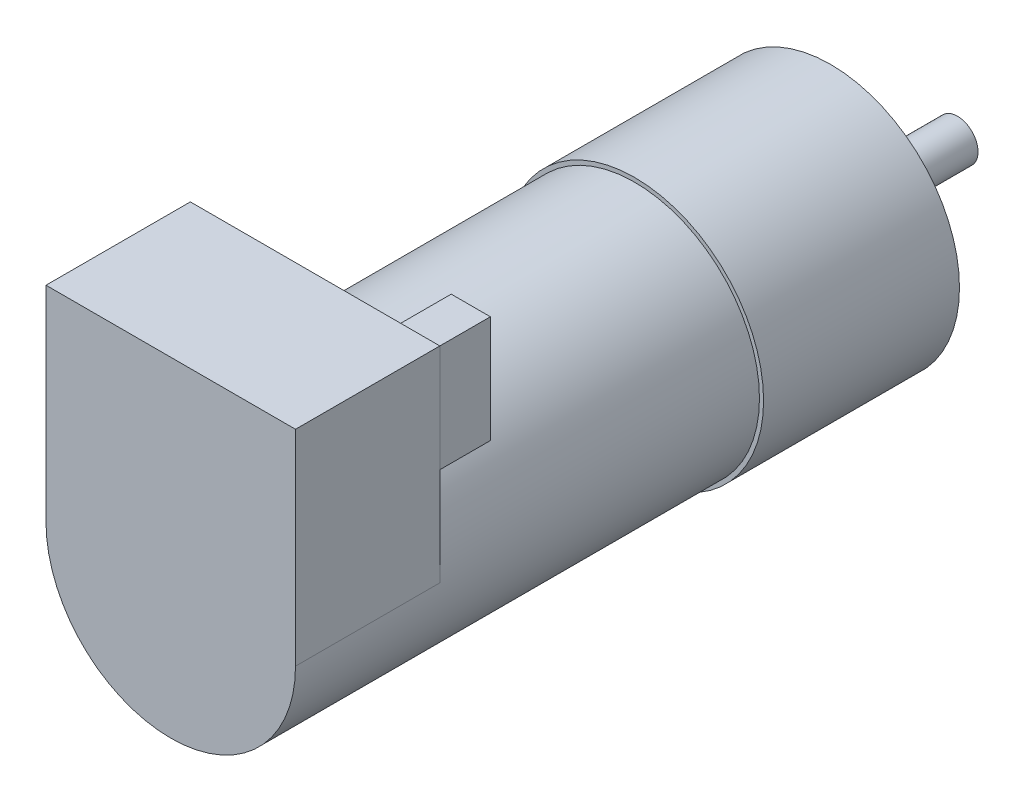
ISO-10303-21;
HEADER;
FILE_DESCRIPTION(('STEP AP214'),'2;1');
FILE_NAME('part.step','',(''),(''),'','','');
FILE_SCHEMA(('AUTOMOTIVE_DESIGN { 1 0 10303 214 1 1 1 1 }'));
ENDSEC;
DATA;
#1=APPLICATION_CONTEXT('core data for automotive mechanical design processes');
#2=APPLICATION_PROTOCOL_DEFINITION('international standard','automotive_design',2000,#1);
#3=PRODUCT_CONTEXT('',#1,'mechanical');
#4=PRODUCT('Part','Part','',(#3));
#5=PRODUCT_RELATED_PRODUCT_CATEGORY('part','',(#4));
#6=PRODUCT_DEFINITION_FORMATION('','',#4);
#7=PRODUCT_DEFINITION_CONTEXT('part definition',#1,'design');
#8=PRODUCT_DEFINITION('design','',#6,#7);
#9=PRODUCT_DEFINITION_SHAPE('','',#8);
#10=(LENGTH_UNIT() NAMED_UNIT(*) SI_UNIT(.MILLI.,.METRE.));
#11=(NAMED_UNIT(*) PLANE_ANGLE_UNIT() SI_UNIT($,.RADIAN.));
#12=(NAMED_UNIT(*) SI_UNIT($,.STERADIAN.) SOLID_ANGLE_UNIT());
#13=UNCERTAINTY_MEASURE_WITH_UNIT(LENGTH_MEASURE(1.E-05),#10,'distance_accuracy_value','');
#14=(GEOMETRIC_REPRESENTATION_CONTEXT(3) GLOBAL_UNCERTAINTY_ASSIGNED_CONTEXT((#13)) GLOBAL_UNIT_ASSIGNED_CONTEXT((#10,
#11,#12)) REPRESENTATION_CONTEXT('',''));
#15=CARTESIAN_POINT('',(0.,0.,0.));
#16=DIRECTION('',(0.,0.,1.));
#17=DIRECTION('',(1.,0.,0.));
#18=AXIS2_PLACEMENT_3D('',#15,#16,#17);
#19=CARTESIAN_POINT('',(0.,0.,50.));
#20=DIRECTION('',(0.,0.,1.));
#21=DIRECTION('',(1.,0.,0.));
#22=AXIS2_PLACEMENT_3D('',#19,#20,#21);
#23=PLANE('',#22);
#24=DIRECTION('',(0.,1.,0.));
#25=VECTOR('',#24,1.);
#26=CARTESIAN_POINT('',(12.1,19.9,50.));
#27=LINE('',#26,#25);
#28=CARTESIAN_POINT('',(12.1,0.,50.));
#29=VERTEX_POINT('',#28);
#30=CARTESIAN_POINT('',(12.1,19.9,50.));
#31=VERTEX_POINT('',#30);
#32=EDGE_CURVE('E122',#29,#31,#27,.T.);
#33=ORIENTED_EDGE('',*,*,#32,.F.);
#34=CARTESIAN_POINT('',(0.,0.,50.));
#35=DIRECTION('',(0.,0.,1.));
#36=DIRECTION('',(1.,0.,0.));
#37=AXIS2_PLACEMENT_3D('',#34,#35,#36);
#38=CIRCLE('',#37,12.1);
#39=CARTESIAN_POINT('',(-12.1,0.,50.));
#40=VERTEX_POINT('',#39);
#41=EDGE_CURVE('E155',#29,#40,#38,.T.);
#42=ORIENTED_EDGE('',*,*,#41,.T.);
#43=DIRECTION('',(0.,-1.,0.));
#44=VECTOR('',#43,1.);
#45=CARTESIAN_POINT('',(-12.1,0.,50.));
#46=LINE('',#45,#44);
#47=CARTESIAN_POINT('',(-12.1,19.9,50.));
#48=VERTEX_POINT('',#47);
#49=EDGE_CURVE('E134',#48,#40,#46,.T.);
#50=ORIENTED_EDGE('',*,*,#49,.F.);
#51=DIRECTION('',(-1.,0.,0.));
#52=VECTOR('',#51,1.);
#53=CARTESIAN_POINT('',(-12.1,19.9,50.));
#54=LINE('',#53,#52);
#55=EDGE_CURVE('E124',#31,#48,#54,.T.);
#56=ORIENTED_EDGE('',*,*,#55,.F.);
#57=EDGE_LOOP('',(#33,#42,#50,#56));
#58=FACE_BOUND('',#57,.T.);
#59=DIRECTION('',(1.,0.,0.));
#60=VECTOR('',#59,1.);
#61=CARTESIAN_POINT('',(12.,19.8,50.));
#62=LINE('',#61,#60);
#63=CARTESIAN_POINT('',(8.2,19.8,50.));
#64=VERTEX_POINT('',#63);
#65=CARTESIAN_POINT('',(12.,19.8,50.));
#66=VERTEX_POINT('',#65);
#67=EDGE_CURVE('E121',#64,#66,#62,.T.);
#68=ORIENTED_EDGE('',*,*,#67,.F.);
#69=DIRECTION('',(0.,1.,0.));
#70=VECTOR('',#69,1.);
#71=CARTESIAN_POINT('',(8.2,19.8,50.));
#72=LINE('',#71,#70);
#73=CARTESIAN_POINT('',(8.2,9.4,50.));
#74=VERTEX_POINT('',#73);
#75=EDGE_CURVE('E118',#74,#64,#72,.T.);
#76=ORIENTED_EDGE('',*,*,#75,.F.);
#77=DIRECTION('',(-1.,0.,0.));
#78=VECTOR('',#77,1.);
#79=CARTESIAN_POINT('',(12.,9.4,50.));
#80=LINE('',#79,#78);
#81=CARTESIAN_POINT('',(12.,9.4,50.));
#82=VERTEX_POINT('',#81);
#83=EDGE_CURVE('E56',#82,#74,#80,.T.);
#84=ORIENTED_EDGE('',*,*,#83,.F.);
#85=DIRECTION('',(0.,-1.,0.));
#86=VECTOR('',#85,1.);
#87=CARTESIAN_POINT('',(12.,19.8,50.));
#88=LINE('',#87,#86);
#89=EDGE_CURVE('E51',#66,#82,#88,.T.);
#90=ORIENTED_EDGE('',*,*,#89,.F.);
#91=EDGE_LOOP('',(#68,#76,#84,#90));
#92=FACE_BOUND('',#91,.T.);
#93=ADVANCED_FACE('F34',(#58,#92),#23,.F.);
#94=CARTESIAN_POINT('',(0.,0.,19.));
#95=DIRECTION('',(0.,0.,-1.));
#96=DIRECTION('',(-1.,0.,0.));
#97=AXIS2_PLACEMENT_3D('',#94,#95,#96);
#98=CYLINDRICAL_SURFACE('',#97,12.5);
#99=CARTESIAN_POINT('',(0.,0.,19.));
#100=DIRECTION('',(0.,0.,1.));
#101=DIRECTION('',(1.,0.,0.));
#102=AXIS2_PLACEMENT_3D('',#99,#100,#101);
#103=CIRCLE('',#102,12.5);
#104=CARTESIAN_POINT('',(12.5,0.,19.));
#105=VERTEX_POINT('',#104);
#106=EDGE_CURVE('E160',#105,#105,#103,.T.);
#107=ORIENTED_EDGE('',*,*,#106,.F.);
#108=EDGE_LOOP('',(#107));
#109=FACE_BOUND('',#108,.T.);
#110=CARTESIAN_POINT('',(0.,0.,0.));
#111=DIRECTION('',(0.,0.,1.));
#112=DIRECTION('',(1.,0.,0.));
#113=AXIS2_PLACEMENT_3D('',#110,#111,#112);
#114=CIRCLE('',#113,12.5);
#115=CARTESIAN_POINT('',(12.5,0.,0.));
#116=VERTEX_POINT('',#115);
#117=EDGE_CURVE('E157',#116,#116,#114,.T.);
#118=ORIENTED_EDGE('',*,*,#117,.T.);
#119=EDGE_LOOP('',(#118));
#120=FACE_BOUND('',#119,.T.);
#121=ADVANCED_FACE('F36',(#109,#120),#98,.T.);
#122=CARTESIAN_POINT('',(0.,0.,19.));
#123=DIRECTION('',(0.,0.,1.));
#124=DIRECTION('',(1.,0.,0.));
#125=AXIS2_PLACEMENT_3D('',#122,#123,#124);
#126=PLANE('',#125);
#127=CARTESIAN_POINT('',(0.,0.,19.));
#128=DIRECTION('',(0.,0.,1.));
#129=DIRECTION('',(1.,0.,0.));
#130=AXIS2_PLACEMENT_3D('',#127,#128,#129);
#131=CIRCLE('',#130,12.1);
#132=CARTESIAN_POINT('',(12.1,0.,19.));
#133=VERTEX_POINT('',#132);
#134=EDGE_CURVE('E43',#133,#133,#131,.T.);
#135=ORIENTED_EDGE('',*,*,#134,.F.);
#136=EDGE_LOOP('',(#135));
#137=FACE_BOUND('',#136,.T.);
#138=ORIENTED_EDGE('',*,*,#106,.T.);
#139=EDGE_LOOP('',(#138));
#140=FACE_BOUND('',#139,.T.);
#141=ADVANCED_FACE('F169',(#137,#140),#126,.T.);
#142=CARTESIAN_POINT('',(0.,0.,0.));
#143=DIRECTION('',(0.,0.,1.));
#144=DIRECTION('',(1.,0.,0.));
#145=AXIS2_PLACEMENT_3D('',#142,#143,#144);
#146=PLANE('',#145);
#147=CARTESIAN_POINT('',(-6.01040764008566,6.01040764008564,0.));
#148=DIRECTION('',(0.,0.,-1.));
#149=DIRECTION('',(-1.,0.,0.));
#150=AXIS2_PLACEMENT_3D('',#147,#148,#149);
#151=CIRCLE('',#150,1.5);
#152=CARTESIAN_POINT('',(-7.51040764008566,6.01040764008564,0.));
#153=VERTEX_POINT('',#152);
#154=EDGE_CURVE('E273',#153,#153,#151,.T.);
#155=ORIENTED_EDGE('',*,*,#154,.F.);
#156=EDGE_LOOP('',(#155));
#157=FACE_BOUND('',#156,.T.);
#158=CARTESIAN_POINT('',(6.0104076400857,-6.0104076400856,0.));
#159=DIRECTION('',(0.,0.,-1.));
#160=DIRECTION('',(-1.,0.,0.));
#161=AXIS2_PLACEMENT_3D('',#158,#159,#160);
#162=CIRCLE('',#161,1.5);
#163=CARTESIAN_POINT('',(4.5104076400857,-6.0104076400856,0.));
#164=VERTEX_POINT('',#163);
#165=EDGE_CURVE('E283',#164,#164,#162,.T.);
#166=ORIENTED_EDGE('',*,*,#165,.F.);
#167=EDGE_LOOP('',(#166));
#168=FACE_BOUND('',#167,.T.);
#169=CARTESIAN_POINT('',(0.,0.,0.));
#170=DIRECTION('',(0.,0.,-1.));
#171=DIRECTION('',(-1.,0.,0.));
#172=AXIS2_PLACEMENT_3D('',#169,#170,#171);
#173=CIRCLE('',#172,3.5);
#174=CARTESIAN_POINT('',(3.5,0.,0.));
#175=VERTEX_POINT('',#174);
#176=EDGE_CURVE('E11',#175,#175,#173,.T.);
#177=ORIENTED_EDGE('',*,*,#176,.F.);
#178=EDGE_LOOP('',(#177));
#179=FACE_BOUND('',#178,.T.);
#180=ORIENTED_EDGE('',*,*,#117,.F.);
#181=EDGE_LOOP('',(#180));
#182=FACE_BOUND('',#181,.T.);
#183=ADVANCED_FACE('F166',(#157,#168,#179,#182),#146,.F.);
#184=CARTESIAN_POINT('',(0.,0.,50.));
#185=DIRECTION('',(0.,0.,-1.));
#186=DIRECTION('',(-1.,0.,0.));
#187=AXIS2_PLACEMENT_3D('',#184,#185,#186);
#188=CYLINDRICAL_SURFACE('',#187,12.1);
#189=ORIENTED_EDGE('',*,*,#41,.F.);
#190=DIRECTION('',(0.,0.,-1.));
#191=VECTOR('',#190,1.);
#192=CARTESIAN_POINT('',(12.1,0.,64.));
#193=LINE('',#192,#191);
#194=CARTESIAN_POINT('',(12.1,0.,64.));
#195=VERTEX_POINT('',#194);
#196=EDGE_CURVE('E152',#195,#29,#193,.T.);
#197=ORIENTED_EDGE('',*,*,#196,.F.);
#198=CARTESIAN_POINT('',(0.,0.,64.));
#199=DIRECTION('',(0.,0.,1.));
#200=DIRECTION('',(1.,0.,0.));
#201=AXIS2_PLACEMENT_3D('',#198,#199,#200);
#202=CIRCLE('',#201,12.1);
#203=CARTESIAN_POINT('',(-12.1,0.,64.));
#204=VERTEX_POINT('',#203);
#205=EDGE_CURVE('E130',#204,#195,#202,.T.);
#206=ORIENTED_EDGE('',*,*,#205,.F.);
#207=DIRECTION('',(0.,0.,-1.));
#208=VECTOR('',#207,1.);
#209=CARTESIAN_POINT('',(-12.1,0.,64.));
#210=LINE('',#209,#208);
#211=EDGE_CURVE('E139',#204,#40,#210,.T.);
#212=ORIENTED_EDGE('',*,*,#211,.T.);
#213=EDGE_LOOP('',(#189,#197,#206,#212));
#214=FACE_BOUND('',#213,.T.);
#215=ORIENTED_EDGE('',*,*,#134,.T.);
#216=EDGE_LOOP('',(#215));
#217=FACE_BOUND('',#216,.T.);
#218=ADVANCED_FACE('F168',(#214,#217),#188,.T.);
#219=CARTESIAN_POINT('',(12.1,19.9,64.));
#220=DIRECTION('',(-1.,0.,0.));
#221=DIRECTION('',(0.,0.,1.));
#222=AXIS2_PLACEMENT_3D('',#219,#220,#221);
#223=PLANE('',#222);
#224=ORIENTED_EDGE('',*,*,#32,.T.);
#225=DIRECTION('',(0.,0.,-1.));
#226=VECTOR('',#225,1.);
#227=CARTESIAN_POINT('',(12.1,19.9,64.));
#228=LINE('',#227,#226);
#229=CARTESIAN_POINT('',(12.1,19.9,64.));
#230=VERTEX_POINT('',#229);
#231=EDGE_CURVE('E149',#230,#31,#228,.T.);
#232=ORIENTED_EDGE('',*,*,#231,.F.);
#233=DIRECTION('',(0.,1.,0.));
#234=VECTOR('',#233,1.);
#235=CARTESIAN_POINT('',(12.1,19.9,64.));
#236=LINE('',#235,#234);
#237=EDGE_CURVE('E133',#195,#230,#236,.T.);
#238=ORIENTED_EDGE('',*,*,#237,.F.);
#239=ORIENTED_EDGE('',*,*,#196,.T.);
#240=EDGE_LOOP('',(#224,#232,#238,#239));
#241=FACE_BOUND('',#240,.T.);
#242=ADVANCED_FACE('F175',(#241),#223,.F.);
#243=CARTESIAN_POINT('',(-12.1,19.9,64.));
#244=DIRECTION('',(0.,-1.,0.));
#245=DIRECTION('',(0.,0.,-1.));
#246=AXIS2_PLACEMENT_3D('',#243,#244,#245);
#247=PLANE('',#246);
#248=ORIENTED_EDGE('',*,*,#55,.T.);
#249=DIRECTION('',(0.,0.,-1.));
#250=VECTOR('',#249,1.);
#251=CARTESIAN_POINT('',(-12.1,19.9,64.));
#252=LINE('',#251,#250);
#253=CARTESIAN_POINT('',(-12.1,19.9,64.));
#254=VERTEX_POINT('',#253);
#255=EDGE_CURVE('E146',#254,#48,#252,.T.);
#256=ORIENTED_EDGE('',*,*,#255,.F.);
#257=DIRECTION('',(-1.,0.,0.));
#258=VECTOR('',#257,1.);
#259=CARTESIAN_POINT('',(-12.1,19.9,64.));
#260=LINE('',#259,#258);
#261=EDGE_CURVE('E136',#230,#254,#260,.T.);
#262=ORIENTED_EDGE('',*,*,#261,.F.);
#263=ORIENTED_EDGE('',*,*,#231,.T.);
#264=EDGE_LOOP('',(#248,#256,#262,#263));
#265=FACE_BOUND('',#264,.T.);
#266=ADVANCED_FACE('F197',(#265),#247,.F.);
#267=CARTESIAN_POINT('',(-12.1,0.,64.));
#268=DIRECTION('',(1.,0.,0.));
#269=DIRECTION('',(0.,0.,-1.));
#270=AXIS2_PLACEMENT_3D('',#267,#268,#269);
#271=PLANE('',#270);
#272=ORIENTED_EDGE('',*,*,#49,.T.);
#273=ORIENTED_EDGE('',*,*,#211,.F.);
#274=DIRECTION('',(0.,-1.,0.));
#275=VECTOR('',#274,1.);
#276=CARTESIAN_POINT('',(-12.1,0.,64.));
#277=LINE('',#276,#275);
#278=EDGE_CURVE('E138',#254,#204,#277,.T.);
#279=ORIENTED_EDGE('',*,*,#278,.F.);
#280=ORIENTED_EDGE('',*,*,#255,.T.);
#281=EDGE_LOOP('',(#272,#273,#279,#280));
#282=FACE_BOUND('',#281,.T.);
#283=ADVANCED_FACE('F194',(#282),#271,.F.);
#284=CARTESIAN_POINT('',(0.,0.,64.));
#285=DIRECTION('',(0.,0.,1.));
#286=DIRECTION('',(1.,0.,0.));
#287=AXIS2_PLACEMENT_3D('',#284,#285,#286);
#288=PLANE('',#287);
#289=ORIENTED_EDGE('',*,*,#205,.T.);
#290=ORIENTED_EDGE('',*,*,#237,.T.);
#291=ORIENTED_EDGE('',*,*,#261,.T.);
#292=ORIENTED_EDGE('',*,*,#278,.T.);
#293=EDGE_LOOP('',(#289,#290,#291,#292));
#294=FACE_BOUND('',#293,.T.);
#295=ADVANCED_FACE('F192',(#294),#288,.T.);
#296=CARTESIAN_POINT('',(12.,19.8,45.));
#297=DIRECTION('',(0.,-1.,0.));
#298=DIRECTION('',(0.,0.,-1.));
#299=AXIS2_PLACEMENT_3D('',#296,#297,#298);
#300=PLANE('',#299);
#301=ORIENTED_EDGE('',*,*,#67,.T.);
#302=DIRECTION('',(0.,0.,1.));
#303=VECTOR('',#302,1.);
#304=CARTESIAN_POINT('',(12.,19.8,45.));
#305=LINE('',#304,#303);
#306=CARTESIAN_POINT('',(12.,19.8,45.));
#307=VERTEX_POINT('',#306);
#308=EDGE_CURVE('E102',#307,#66,#305,.T.);
#309=ORIENTED_EDGE('',*,*,#308,.F.);
#310=DIRECTION('',(1.,0.,0.));
#311=VECTOR('',#310,1.);
#312=CARTESIAN_POINT('',(12.,19.8,45.));
#313=LINE('',#312,#311);
#314=CARTESIAN_POINT('',(8.2,19.8,45.));
#315=VERTEX_POINT('',#314);
#316=EDGE_CURVE('E109',#315,#307,#313,.T.);
#317=ORIENTED_EDGE('',*,*,#316,.F.);
#318=DIRECTION('',(0.,0.,1.));
#319=VECTOR('',#318,1.);
#320=CARTESIAN_POINT('',(8.2,19.8,45.));
#321=LINE('',#320,#319);
#322=EDGE_CURVE('E291',#315,#64,#321,.T.);
#323=ORIENTED_EDGE('',*,*,#322,.T.);
#324=EDGE_LOOP('',(#301,#309,#317,#323));
#325=FACE_BOUND('',#324,.T.);
#326=ADVANCED_FACE('F120',(#325),#300,.F.);
#327=CARTESIAN_POINT('',(12.,19.8,45.));
#328=DIRECTION('',(-1.,0.,0.));
#329=DIRECTION('',(0.,0.,1.));
#330=AXIS2_PLACEMENT_3D('',#327,#328,#329);
#331=PLANE('',#330);
#332=ORIENTED_EDGE('',*,*,#89,.T.);
#333=DIRECTION('',(0.,0.,1.));
#334=VECTOR('',#333,1.);
#335=CARTESIAN_POINT('',(12.,9.4,45.));
#336=LINE('',#335,#334);
#337=CARTESIAN_POINT('',(12.,9.4,45.));
#338=VERTEX_POINT('',#337);
#339=EDGE_CURVE('E105',#338,#82,#336,.T.);
#340=ORIENTED_EDGE('',*,*,#339,.F.);
#341=DIRECTION('',(0.,-1.,0.));
#342=VECTOR('',#341,1.);
#343=CARTESIAN_POINT('',(12.,19.8,45.));
#344=LINE('',#343,#342);
#345=EDGE_CURVE('E98',#307,#338,#344,.T.);
#346=ORIENTED_EDGE('',*,*,#345,.F.);
#347=ORIENTED_EDGE('',*,*,#308,.T.);
#348=EDGE_LOOP('',(#332,#340,#346,#347));
#349=FACE_BOUND('',#348,.T.);
#350=ADVANCED_FACE('F100',(#349),#331,.F.);
#351=CARTESIAN_POINT('',(12.,9.4,45.));
#352=DIRECTION('',(0.,1.,0.));
#353=DIRECTION('',(0.,0.,1.));
#354=AXIS2_PLACEMENT_3D('',#351,#352,#353);
#355=PLANE('',#354);
#356=ORIENTED_EDGE('',*,*,#83,.T.);
#357=DIRECTION('',(0.,0.,1.));
#358=VECTOR('',#357,1.);
#359=CARTESIAN_POINT('',(8.2,9.4,45.));
#360=LINE('',#359,#358);
#361=CARTESIAN_POINT('',(8.2,9.4,45.));
#362=VERTEX_POINT('',#361);
#363=EDGE_CURVE('E126',#362,#74,#360,.T.);
#364=ORIENTED_EDGE('',*,*,#363,.F.);
#365=DIRECTION('',(-1.,0.,0.));
#366=VECTOR('',#365,1.);
#367=CARTESIAN_POINT('',(12.,9.4,45.));
#368=LINE('',#367,#366);
#369=EDGE_CURVE('E108',#338,#362,#368,.T.);
#370=ORIENTED_EDGE('',*,*,#369,.F.);
#371=ORIENTED_EDGE('',*,*,#339,.T.);
#372=EDGE_LOOP('',(#356,#364,#370,#371));
#373=FACE_BOUND('',#372,.T.);
#374=ADVANCED_FACE('F224',(#373),#355,.F.);
#375=CARTESIAN_POINT('',(8.2,19.8,45.));
#376=DIRECTION('',(1.,0.,0.));
#377=DIRECTION('',(0.,1.,0.));
#378=AXIS2_PLACEMENT_3D('',#375,#376,#377);
#379=PLANE('',#378);
#380=ORIENTED_EDGE('',*,*,#75,.T.);
#381=ORIENTED_EDGE('',*,*,#322,.F.);
#382=DIRECTION('',(0.,1.,0.));
#383=VECTOR('',#382,1.);
#384=CARTESIAN_POINT('',(8.2,19.8,45.));
#385=LINE('',#384,#383);
#386=EDGE_CURVE('E114',#362,#315,#385,.T.);
#387=ORIENTED_EDGE('',*,*,#386,.F.);
#388=ORIENTED_EDGE('',*,*,#363,.T.);
#389=EDGE_LOOP('',(#380,#381,#387,#388));
#390=FACE_BOUND('',#389,.T.);
#391=ADVANCED_FACE('F229',(#390),#379,.F.);
#392=CARTESIAN_POINT('',(0.,0.,45.));
#393=DIRECTION('',(0.,0.,1.));
#394=DIRECTION('',(1.,0.,0.));
#395=AXIS2_PLACEMENT_3D('',#392,#393,#394);
#396=PLANE('',#395);
#397=ORIENTED_EDGE('',*,*,#316,.T.);
#398=ORIENTED_EDGE('',*,*,#345,.T.);
#399=ORIENTED_EDGE('',*,*,#369,.T.);
#400=ORIENTED_EDGE('',*,*,#386,.T.);
#401=EDGE_LOOP('',(#397,#398,#399,#400));
#402=FACE_BOUND('',#401,.T.);
#403=ADVANCED_FACE('F112',(#402),#396,.F.);
#404=CARTESIAN_POINT('',(0.,0.,-2.7));
#405=DIRECTION('',(0.,0.,1.));
#406=DIRECTION('',(1.,0.,0.));
#407=AXIS2_PLACEMENT_3D('',#404,#405,#406);
#408=CYLINDRICAL_SURFACE('',#407,3.5);
#409=CARTESIAN_POINT('',(0.,0.,-2.7));
#410=DIRECTION('',(0.,0.,-1.));
#411=DIRECTION('',(-1.,0.,0.));
#412=AXIS2_PLACEMENT_3D('',#409,#410,#411);
#413=CIRCLE('',#412,3.5);
#414=CARTESIAN_POINT('',(3.5,0.,-2.7));
#415=VERTEX_POINT('',#414);
#416=EDGE_CURVE('E286',#415,#415,#413,.T.);
#417=CARTESIAN_POINT('',(3.5,0.,-2.7));
#418=CARTESIAN_POINT('',(3.5,0.,-2.671875));
#419=CARTESIAN_POINT('',(3.5,0.,-2.64375));
#420=CARTESIAN_POINT('',(3.5,0.,-2.5875));
#421=CARTESIAN_POINT('',(3.5,0.,-2.559375));
#422=CARTESIAN_POINT('',(3.5,0.,-2.503125));
#423=CARTESIAN_POINT('',(3.5,0.,-2.475));
#424=CARTESIAN_POINT('',(3.5,0.,-2.41875));
#425=CARTESIAN_POINT('',(3.5,0.,-2.390625));
#426=CARTESIAN_POINT('',(3.5,0.,-2.334375));
#427=CARTESIAN_POINT('',(3.5,0.,-2.30625));
#428=CARTESIAN_POINT('',(3.5,0.,-2.25));
#429=CARTESIAN_POINT('',(3.5,0.,-2.221875));
#430=CARTESIAN_POINT('',(3.5,0.,-2.165625));
#431=CARTESIAN_POINT('',(3.5,0.,-2.1375));
#432=CARTESIAN_POINT('',(3.5,0.,-2.08125));
#433=CARTESIAN_POINT('',(3.5,0.,-2.053125));
#434=CARTESIAN_POINT('',(3.5,0.,-1.996875));
#435=CARTESIAN_POINT('',(3.5,0.,-1.96875));
#436=CARTESIAN_POINT('',(3.5,0.,-1.9125));
#437=CARTESIAN_POINT('',(3.5,0.,-1.884375));
#438=CARTESIAN_POINT('',(3.5,0.,-1.828125));
#439=CARTESIAN_POINT('',(3.5,0.,-1.8));
#440=CARTESIAN_POINT('',(3.5,0.,-1.74375));
#441=CARTESIAN_POINT('',(3.5,0.,-1.715625));
#442=CARTESIAN_POINT('',(3.5,0.,-1.659375));
#443=CARTESIAN_POINT('',(3.5,0.,-1.63125));
#444=CARTESIAN_POINT('',(3.5,0.,-1.575));
#445=CARTESIAN_POINT('',(3.5,0.,-1.546875));
#446=CARTESIAN_POINT('',(3.5,0.,-1.490625));
#447=CARTESIAN_POINT('',(3.5,0.,-1.4625));
#448=CARTESIAN_POINT('',(3.5,0.,-1.40625));
#449=CARTESIAN_POINT('',(3.5,0.,-1.378125));
#450=CARTESIAN_POINT('',(3.5,0.,-1.321875));
#451=CARTESIAN_POINT('',(3.5,0.,-1.29375));
#452=CARTESIAN_POINT('',(3.5,0.,-1.2375));
#453=CARTESIAN_POINT('',(3.5,0.,-1.209375));
#454=CARTESIAN_POINT('',(3.5,0.,-1.153125));
#455=CARTESIAN_POINT('',(3.5,0.,-1.125));
#456=CARTESIAN_POINT('',(3.5,0.,-1.06875));
#457=CARTESIAN_POINT('',(3.5,0.,-1.040625));
#458=CARTESIAN_POINT('',(3.5,0.,-0.984375));
#459=CARTESIAN_POINT('',(3.5,0.,-0.956249999999999));
#460=CARTESIAN_POINT('',(3.5,0.,-0.899999999999999));
#461=CARTESIAN_POINT('',(3.5,0.,-0.871875));
#462=CARTESIAN_POINT('',(3.5,0.,-0.815624999999999));
#463=CARTESIAN_POINT('',(3.5,0.,-0.787499999999999));
#464=CARTESIAN_POINT('',(3.5,0.,-0.73125));
#465=CARTESIAN_POINT('',(3.5,0.,-0.703125));
#466=CARTESIAN_POINT('',(3.5,0.,-0.646875));
#467=CARTESIAN_POINT('',(3.5,0.,-0.61875));
#468=CARTESIAN_POINT('',(3.5,0.,-0.5625));
#469=CARTESIAN_POINT('',(3.5,0.,-0.534375));
#470=CARTESIAN_POINT('',(3.5,0.,-0.478125));
#471=CARTESIAN_POINT('',(3.5,0.,-0.45));
#472=CARTESIAN_POINT('',(3.5,0.,-0.39375));
#473=CARTESIAN_POINT('',(3.5,0.,-0.365625));
#474=CARTESIAN_POINT('',(3.5,0.,-0.309375));
#475=CARTESIAN_POINT('',(3.5,0.,-0.28125));
#476=CARTESIAN_POINT('',(3.5,0.,-0.225));
#477=CARTESIAN_POINT('',(3.5,0.,-0.196875));
#478=CARTESIAN_POINT('',(3.5,0.,-0.140625));
#479=CARTESIAN_POINT('',(3.5,0.,-0.1125));
#480=CARTESIAN_POINT('',(3.5,0.,-0.0562499999999997));
#481=CARTESIAN_POINT('',(3.5,0.,-0.0281249999999996));
#482=CARTESIAN_POINT('',(3.5,0.,0.));
#483=B_SPLINE_CURVE_WITH_KNOTS('',3,(#417,#418,#419,#420,#421,#422,#423,#424,#425,#426,#427,
#428,#429,#430,#431,#432,#433,#434,#435,#436,#437,#438,#439,#440,#441,#442,#443,#444,#445,#446,
#447,#448,#449,#450,#451,#452,#453,#454,#455,#456,#457,#458,#459,#460,#461,#462,#463,#464,#465,
#466,#467,#468,#469,#470,#471,#472,#473,#474,#475,#476,#477,#478,#479,#480,#481,#482),
.UNSPECIFIED.,.F.,.F.,(4,2,2,2,2,2,2,2,2,2,2,2,2,2,2,2,2,2,2,2,2,2,2,2,2,2,2,2,2,2,2,2,4),(0.,
0.0843750000000003,0.16875,0.253125,0.3375,0.421875,0.50625,0.590625,0.675,0.759375,0.84375,
0.928125000000001,1.0125,1.096875,1.18125,1.265625,1.35,1.434375,1.51875,1.603125,1.6875,
1.771875,1.85625,1.940625,2.025,2.109375,2.19375,2.278125,2.3625,2.446875,2.53125,2.615625,2.7),.UNSPECIFIED.);
#484=EDGE_CURVE('BSEAM236',#415,#175,#483,.T.);
#485=ORIENTED_EDGE('',*,*,#416,.F.);
#486=ORIENTED_EDGE('',*,*,#176,.T.);
#487=ORIENTED_EDGE('',*,*,#484,.T.);
#488=ORIENTED_EDGE('',*,*,#484,.F.);
#489=EDGE_LOOP('',(#485,#487,#486,#488));
#490=FACE_BOUND('',#489,.T.);
#491=ADVANCED_FACE('F236',(#490),#408,.T.);
#492=CARTESIAN_POINT('',(0.,0.,-2.7));
#493=DIRECTION('',(0.,0.,-1.));
#494=DIRECTION('',(-1.,0.,0.));
#495=AXIS2_PLACEMENT_3D('',#492,#493,#494);
#496=PLANE('',#495);
#497=CARTESIAN_POINT('',(0.,0.,-2.7));
#498=DIRECTION('',(0.,0.,-1.));
#499=DIRECTION('',(-1.,0.,0.));
#500=AXIS2_PLACEMENT_3D('',#497,#498,#499);
#501=CIRCLE('',#500,2.);
#502=CARTESIAN_POINT('',(-2.,0.,-2.7));
#503=VERTEX_POINT('',#502);
#504=EDGE_CURVE('E38',#503,#503,#501,.F.);
#505=ORIENTED_EDGE('',*,*,#504,.T.);
#506=EDGE_LOOP('',(#505));
#507=FACE_BOUND('',#506,.T.);
#508=ORIENTED_EDGE('',*,*,#416,.T.);
#509=EDGE_LOOP('',(#508));
#510=FACE_BOUND('',#509,.T.);
#511=ADVANCED_FACE('F239',(#507,#510),#496,.T.);
#512=CARTESIAN_POINT('',(0.,0.,-12.3));
#513=DIRECTION('',(0.,0.,1.));
#514=DIRECTION('',(1.,0.,0.));
#515=AXIS2_PLACEMENT_3D('',#512,#513,#514);
#516=CYLINDRICAL_SURFACE('',#515,2.);
#517=ORIENTED_EDGE('',*,*,#504,.F.);
#518=EDGE_LOOP('',(#517));
#519=FACE_BOUND('',#518,.T.);
#520=CARTESIAN_POINT('',(0.,0.,-12.3));
#521=DIRECTION('',(0.,0.,-1.));
#522=DIRECTION('',(-1.,0.,0.));
#523=AXIS2_PLACEMENT_3D('',#520,#521,#522);
#524=CIRCLE('',#523,2.);
#525=CARTESIAN_POINT('',(-2.,0.,-12.3));
#526=VERTEX_POINT('',#525);
#527=EDGE_CURVE('E272',#526,#526,#524,.T.);
#528=ORIENTED_EDGE('',*,*,#527,.F.);
#529=EDGE_LOOP('',(#528));
#530=FACE_BOUND('',#529,.T.);
#531=ADVANCED_FACE('F243',(#519,#530),#516,.T.);
#532=CARTESIAN_POINT('',(0.,0.,-12.3));
#533=DIRECTION('',(0.,0.,-1.));
#534=DIRECTION('',(-1.,0.,0.));
#535=AXIS2_PLACEMENT_3D('',#532,#533,#534);
#536=PLANE('',#535);
#537=ORIENTED_EDGE('',*,*,#527,.T.);
#538=EDGE_LOOP('',(#537));
#539=FACE_BOUND('',#538,.T.);
#540=ADVANCED_FACE('F247',(#539),#536,.T.);
#541=CARTESIAN_POINT('',(6.0104076400857,-6.0104076400856,5.));
#542=DIRECTION('',(0.,0.,-1.));
#543=DIRECTION('',(-1.,0.,0.));
#544=AXIS2_PLACEMENT_3D('',#541,#542,#543);
#545=CYLINDRICAL_SURFACE('',#544,1.5);
#546=CARTESIAN_POINT('',(6.0104076400857,-6.0104076400856,5.));
#547=DIRECTION('',(0.,0.,-1.));
#548=DIRECTION('',(-1.,0.,0.));
#549=AXIS2_PLACEMENT_3D('',#546,#547,#548);
#550=CIRCLE('',#549,1.5);
#551=CARTESIAN_POINT('',(4.5104076400857,-6.0104076400856,5.));
#552=VERTEX_POINT('',#551);
#553=EDGE_CURVE('E278',#552,#552,#550,.T.);
#554=ORIENTED_EDGE('',*,*,#553,.F.);
#555=EDGE_LOOP('',(#554));
#556=FACE_BOUND('',#555,.T.);
#557=ORIENTED_EDGE('',*,*,#165,.T.);
#558=EDGE_LOOP('',(#557));
#559=FACE_BOUND('',#558,.T.);
#560=ADVANCED_FACE('F251',(#556,#559),#545,.F.);
#561=CARTESIAN_POINT('',(6.0104076400857,-6.0104076400856,5.));
#562=DIRECTION('',(0.,0.,-1.));
#563=DIRECTION('',(-1.,0.,0.));
#564=AXIS2_PLACEMENT_3D('',#561,#562,#563);
#565=PLANE('',#564);
#566=ORIENTED_EDGE('',*,*,#553,.T.);
#567=EDGE_LOOP('',(#566));
#568=FACE_BOUND('',#567,.T.);
#569=ADVANCED_FACE('F255',(#568),#565,.T.);
#570=CARTESIAN_POINT('',(-6.01040764008566,6.01040764008564,5.));
#571=DIRECTION('',(0.,0.,-1.));
#572=DIRECTION('',(-1.,0.,0.));
#573=AXIS2_PLACEMENT_3D('',#570,#571,#572);
#574=CYLINDRICAL_SURFACE('',#573,1.5);
#575=CARTESIAN_POINT('',(-6.01040764008566,6.01040764008564,5.));
#576=DIRECTION('',(0.,0.,-1.));
#577=DIRECTION('',(-1.,0.,0.));
#578=AXIS2_PLACEMENT_3D('',#575,#576,#577);
#579=CIRCLE('',#578,1.5);
#580=CARTESIAN_POINT('',(-7.51040764008566,6.01040764008564,5.));
#581=VERTEX_POINT('',#580);
#582=EDGE_CURVE('E271',#581,#581,#579,.T.);
#583=ORIENTED_EDGE('',*,*,#582,.F.);
#584=EDGE_LOOP('',(#583));
#585=FACE_BOUND('',#584,.T.);
#586=ORIENTED_EDGE('',*,*,#154,.T.);
#587=EDGE_LOOP('',(#586));
#588=FACE_BOUND('',#587,.T.);
#589=ADVANCED_FACE('F259',(#585,#588),#574,.F.);
#590=CARTESIAN_POINT('',(-6.01040764008566,6.01040764008564,5.));
#591=DIRECTION('',(0.,0.,-1.));
#592=DIRECTION('',(-1.,0.,0.));
#593=AXIS2_PLACEMENT_3D('',#590,#591,#592);
#594=PLANE('',#593);
#595=ORIENTED_EDGE('',*,*,#582,.T.);
#596=EDGE_LOOP('',(#595));
#597=FACE_BOUND('',#596,.T.);
#598=ADVANCED_FACE('F263',(#597),#594,.T.);
#599=CLOSED_SHELL('',(#93,#121,#141,#183,#218,#242,#266,#283,#295,#326,#350,#374,#391,#403,#491,
#511,#531,#540,#560,#569,#589,#598));
#600=MANIFOLD_SOLID_BREP('B2',#599);
#601=ADVANCED_BREP_SHAPE_REPRESENTATION('',(#18,#600),#14);
#602=SHAPE_DEFINITION_REPRESENTATION(#9,#601);
ENDSEC;
END-ISO-10303-21;
